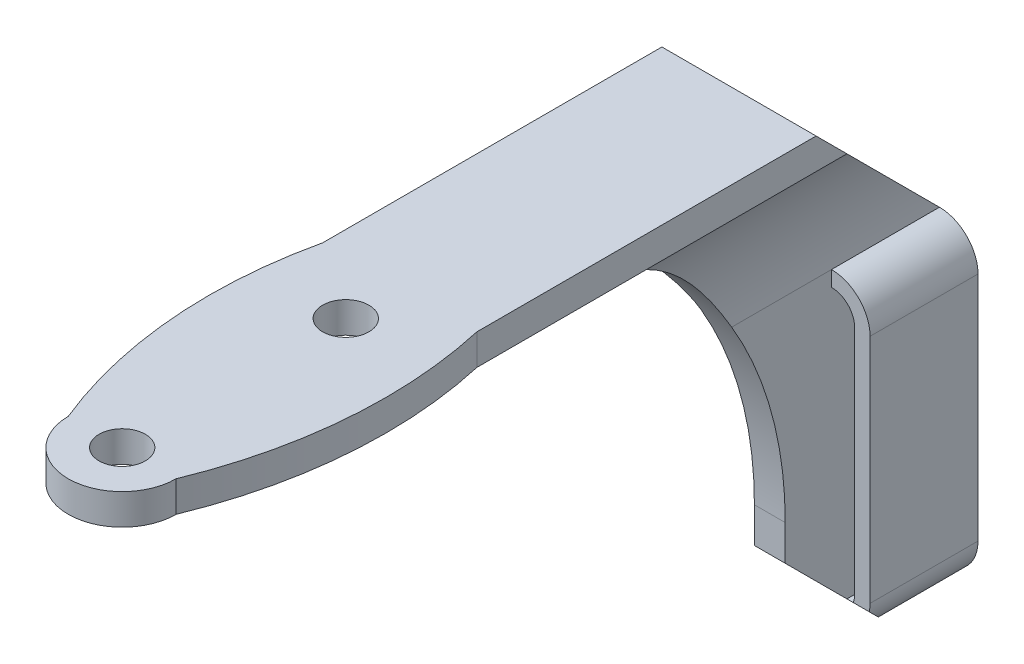
ISO-10303-21;
HEADER;
FILE_DESCRIPTION(('STEP AP214'),'2;1');
FILE_NAME('part.step','',(''),(''),'','','');
FILE_SCHEMA(('AUTOMOTIVE_DESIGN { 1 0 10303 214 1 1 1 1 }'));
ENDSEC;
DATA;
#1=APPLICATION_CONTEXT('core data for automotive mechanical design processes');
#2=APPLICATION_PROTOCOL_DEFINITION('international standard','automotive_design',2000,#1);
#3=PRODUCT_CONTEXT('',#1,'mechanical');
#4=PRODUCT('Part','Part','',(#3));
#5=PRODUCT_RELATED_PRODUCT_CATEGORY('part','',(#4));
#6=PRODUCT_DEFINITION_FORMATION('','',#4);
#7=PRODUCT_DEFINITION_CONTEXT('part definition',#1,'design');
#8=PRODUCT_DEFINITION('design','',#6,#7);
#9=PRODUCT_DEFINITION_SHAPE('','',#8);
#10=(LENGTH_UNIT() NAMED_UNIT(*) SI_UNIT(.MILLI.,.METRE.));
#11=(NAMED_UNIT(*) PLANE_ANGLE_UNIT() SI_UNIT($,.RADIAN.));
#12=(NAMED_UNIT(*) SI_UNIT($,.STERADIAN.) SOLID_ANGLE_UNIT());
#13=UNCERTAINTY_MEASURE_WITH_UNIT(LENGTH_MEASURE(1.E-05),#10,'distance_accuracy_value','');
#14=(GEOMETRIC_REPRESENTATION_CONTEXT(3) GLOBAL_UNCERTAINTY_ASSIGNED_CONTEXT((#13)) GLOBAL_UNIT_ASSIGNED_CONTEXT((#10,
#11,#12)) REPRESENTATION_CONTEXT('',''));
#15=CARTESIAN_POINT('',(0.,0.,0.));
#16=DIRECTION('',(0.,0.,1.));
#17=DIRECTION('',(1.,0.,0.));
#18=AXIS2_PLACEMENT_3D('',#15,#16,#17);
#19=CARTESIAN_POINT('',(3.,-8.00000000000004,3.501));
#20=DIRECTION('',(-1.,0.,0.));
#21=DIRECTION('',(0.,-1.,0.));
#22=AXIS2_PLACEMENT_3D('',#19,#20,#21);
#23=PLANE('',#22);
#24=DIRECTION('',(0.,1.,0.));
#25=VECTOR('',#24,1.);
#26=CARTESIAN_POINT('',(3.,-8.00000000000004,-40.));
#27=LINE('',#26,#25);
#28=CARTESIAN_POINT('',(3.,-23.,-40.));
#29=VERTEX_POINT('',#28);
#30=CARTESIAN_POINT('',(3.,-20.712315177208,-40.));
#31=VERTEX_POINT('',#30);
#32=EDGE_CURVE('E210',#29,#31,#27,.T.);
#33=ORIENTED_EDGE('',*,*,#32,.F.);
#34=DIRECTION('',(0.,0.707106781186549,0.707106781186546));
#35=VECTOR('',#34,1.);
#36=CARTESIAN_POINT('',(3.,-28.,-45.));
#37=LINE('',#36,#35);
#38=CARTESIAN_POINT('',(3.,-27.,-44.));
#39=VERTEX_POINT('',#38);
#40=EDGE_CURVE('E247',#29,#39,#37,.F.);
#41=ORIENTED_EDGE('',*,*,#40,.T.);
#42=DIRECTION('',(0.,0.,-1.));
#43=VECTOR('',#42,1.);
#44=CARTESIAN_POINT('',(3.,-27.,-43.));
#45=LINE('',#44,#43);
#46=CARTESIAN_POINT('',(3.,-27.,-50.));
#47=VERTEX_POINT('',#46);
#48=EDGE_CURVE('E199',#39,#47,#45,.T.);
#49=ORIENTED_EDGE('',*,*,#48,.T.);
#50=DIRECTION('',(0.,1.,0.));
#51=VECTOR('',#50,1.);
#52=CARTESIAN_POINT('',(3.,-8.00000000000004,-50.));
#53=LINE('',#52,#51);
#54=CARTESIAN_POINT('',(3.,-9.00000000000004,-50.));
#55=VERTEX_POINT('',#54);
#56=EDGE_CURVE('E225',#47,#55,#53,.T.);
#57=ORIENTED_EDGE('',*,*,#56,.T.);
#58=DIRECTION('',(0.,0.,-1.));
#59=VECTOR('',#58,1.);
#60=CARTESIAN_POINT('',(3.,-9.00000000000004,-43.));
#61=LINE('',#60,#59);
#62=CARTESIAN_POINT('',(3.,-9.00000000000004,-43.));
#63=VERTEX_POINT('',#62);
#64=EDGE_CURVE('E201',#63,#55,#61,.T.);
#65=ORIENTED_EDGE('',*,*,#64,.F.);
#66=DIRECTION('',(0.,-1.,0.));
#67=VECTOR('',#66,1.);
#68=CARTESIAN_POINT('',(3.,0.,-43.));
#69=LINE('',#68,#67);
#70=CARTESIAN_POINT('',(3.,-8.00000000000004,-43.));
#71=VERTEX_POINT('',#70);
#72=EDGE_CURVE('E434',#71,#63,#69,.T.);
#73=ORIENTED_EDGE('',*,*,#72,.F.);
#74=DIRECTION('',(0.,0.,-1.));
#75=VECTOR('',#74,1.);
#76=CARTESIAN_POINT('',(3.,-8.00000000000004,3.501));
#77=LINE('',#76,#75);
#78=CARTESIAN_POINT('',(3.,-8.00000000000005,-36.5266588869552));
#79=VERTEX_POINT('',#78);
#80=EDGE_CURVE('E331',#79,#71,#77,.T.);
#81=ORIENTED_EDGE('',*,*,#80,.F.);
#82=CARTESIAN_POINT('',(3.,-20.712315177208,-15.));
#83=DIRECTION('',(-1.,0.,0.));
#84=DIRECTION('',(0.,-1.,0.));
#85=AXIS2_PLACEMENT_3D('',#82,#83,#84);
#86=CIRCLE('',#85,25.);
#87=EDGE_CURVE('E213',#31,#79,#86,.F.);
#88=ORIENTED_EDGE('',*,*,#87,.F.);
#89=EDGE_LOOP('',(#33,#41,#49,#57,#65,#73,#81,#88));
#90=FACE_BOUND('',#89,.T.);
#91=ADVANCED_FACE('F39',(#90),#23,.F.);
#92=CARTESIAN_POINT('',(-5.,2.,0.));
#93=DIRECTION('',(-1.,0.,0.));
#94=DIRECTION('',(0.,0.,1.));
#95=AXIS2_PLACEMENT_3D('',#92,#93,#94);
#96=PLANE('',#95);
#97=DIRECTION('',(0.,0.,-1.));
#98=VECTOR('',#97,1.);
#99=CARTESIAN_POINT('',(-5.,0.,3.501));
#100=LINE('',#99,#98);
#101=CARTESIAN_POINT('',(-5.,0.,-29.));
#102=VERTEX_POINT('',#101);
#103=CARTESIAN_POINT('',(-5.,0.,-42.));
#104=VERTEX_POINT('',#103);
#105=EDGE_CURVE('E337',#102,#104,#100,.T.);
#106=ORIENTED_EDGE('',*,*,#105,.F.);
#107=DIRECTION('',(0.,0.,-1.));
#108=VECTOR('',#107,1.);
#109=CARTESIAN_POINT('',(-5.,0.,0.));
#110=LINE('',#109,#108);
#111=CARTESIAN_POINT('',(-5.,0.,-18.));
#112=VERTEX_POINT('',#111);
#113=EDGE_CURVE('E292',#112,#102,#110,.T.);
#114=ORIENTED_EDGE('',*,*,#113,.F.);
#115=DIRECTION('',(0.,-1.,0.));
#116=VECTOR('',#115,1.);
#117=CARTESIAN_POINT('',(-5.,2.,-18.));
#118=LINE('',#117,#116);
#119=CARTESIAN_POINT('',(-5.,2.,-18.));
#120=VERTEX_POINT('',#119);
#121=EDGE_CURVE('E264',#120,#112,#118,.T.);
#122=ORIENTED_EDGE('',*,*,#121,.F.);
#123=DIRECTION('',(0.,0.,-1.));
#124=VECTOR('',#123,1.);
#125=CARTESIAN_POINT('',(-5.,2.,0.));
#126=LINE('',#125,#124);
#127=CARTESIAN_POINT('',(-5.,2.,-40.));
#128=VERTEX_POINT('',#127);
#129=EDGE_CURVE('E278',#120,#128,#126,.T.);
#130=ORIENTED_EDGE('',*,*,#129,.T.);
#131=DIRECTION('',(0.,-0.707106781186549,-0.707106781186546));
#132=VECTOR('',#131,1.);
#133=CARTESIAN_POINT('',(-5.,2.,-40.));
#134=LINE('',#133,#132);
#135=EDGE_CURVE('E322',#128,#104,#134,.T.);
#136=ORIENTED_EDGE('',*,*,#135,.T.);
#137=EDGE_LOOP('',(#106,#114,#122,#130,#136));
#138=FACE_BOUND('',#137,.T.);
#139=ADVANCED_FACE('F235',(#138),#96,.T.);
#140=CARTESIAN_POINT('',(24.2595265384797,2.,-11.3757938782066));
#141=DIRECTION('',(0.,-1.,0.));
#142=DIRECTION('',(0.,0.,-1.));
#143=AXIS2_PLACEMENT_3D('',#140,#141,#142);
#144=CYLINDRICAL_SURFACE('',#143,30.);
#145=CARTESIAN_POINT('',(24.2595265384797,0.,-11.3757938782066));
#146=DIRECTION('',(0.,1.,0.));
#147=DIRECTION('',(0.,0.,1.));
#148=AXIS2_PLACEMENT_3D('',#145,#146,#147);
#149=CIRCLE('',#148,30.);
#150=CARTESIAN_POINT('',(-3.5,0.,0.));
#151=VERTEX_POINT('',#150);
#152=EDGE_CURVE('E289',#151,#112,#149,.F.);
#153=ORIENTED_EDGE('',*,*,#152,.F.);
#154=DIRECTION('',(0.,-1.,0.));
#155=VECTOR('',#154,1.);
#156=CARTESIAN_POINT('',(-3.5,2.,0.));
#157=LINE('',#156,#155);
#158=CARTESIAN_POINT('',(-3.5,2.,0.));
#159=VERTEX_POINT('',#158);
#160=EDGE_CURVE('E266',#159,#151,#157,.T.);
#161=ORIENTED_EDGE('',*,*,#160,.F.);
#162=CARTESIAN_POINT('',(24.2595265384797,2.,-11.3757938782066));
#163=DIRECTION('',(0.,1.,0.));
#164=DIRECTION('',(0.,0.,1.));
#165=AXIS2_PLACEMENT_3D('',#162,#163,#164);
#166=CIRCLE('',#165,30.);
#167=EDGE_CURVE('E311',#159,#120,#166,.F.);
#168=ORIENTED_EDGE('',*,*,#167,.T.);
#169=ORIENTED_EDGE('',*,*,#121,.T.);
#170=EDGE_LOOP('',(#153,#161,#168,#169));
#171=FACE_BOUND('',#170,.T.);
#172=ADVANCED_FACE('F242',(#171),#144,.T.);
#173=CARTESIAN_POINT('',(0.,2.,0.));
#174=DIRECTION('',(0.,-1.,0.));
#175=DIRECTION('',(0.,0.,-1.));
#176=AXIS2_PLACEMENT_3D('',#173,#174,#175);
#177=CYLINDRICAL_SURFACE('',#176,3.5);
#178=CARTESIAN_POINT('',(0.,0.,0.));
#179=DIRECTION('',(0.,1.,0.));
#180=DIRECTION('',(0.,0.,1.));
#181=AXIS2_PLACEMENT_3D('',#178,#179,#180);
#182=CIRCLE('',#181,3.5);
#183=CARTESIAN_POINT('',(3.5,0.,0.));
#184=VERTEX_POINT('',#183);
#185=EDGE_CURVE('E287',#151,#184,#182,.T.);
#186=ORIENTED_EDGE('',*,*,#185,.T.);
#187=DIRECTION('',(0.,-1.,0.));
#188=VECTOR('',#187,1.);
#189=CARTESIAN_POINT('',(3.5,2.,0.));
#190=LINE('',#189,#188);
#191=CARTESIAN_POINT('',(3.5,2.,0.));
#192=VERTEX_POINT('',#191);
#193=EDGE_CURVE('E268',#192,#184,#190,.T.);
#194=ORIENTED_EDGE('',*,*,#193,.F.);
#195=CARTESIAN_POINT('',(0.,2.,0.));
#196=DIRECTION('',(0.,1.,0.));
#197=DIRECTION('',(0.,0.,1.));
#198=AXIS2_PLACEMENT_3D('',#195,#196,#197);
#199=CIRCLE('',#198,3.5);
#200=EDGE_CURVE('E309',#159,#192,#199,.T.);
#201=ORIENTED_EDGE('',*,*,#200,.F.);
#202=ORIENTED_EDGE('',*,*,#160,.T.);
#203=EDGE_LOOP('',(#186,#194,#201,#202));
#204=FACE_BOUND('',#203,.T.);
#205=ADVANCED_FACE('F471',(#204),#177,.T.);
#206=CARTESIAN_POINT('',(-24.2595265384797,2.,-11.3757938782066));
#207=DIRECTION('',(0.,-1.,0.));
#208=DIRECTION('',(0.,0.,-1.));
#209=AXIS2_PLACEMENT_3D('',#206,#207,#208);
#210=CYLINDRICAL_SURFACE('',#209,30.);
#211=CARTESIAN_POINT('',(-24.2595265384797,0.,-11.3757938782066));
#212=DIRECTION('',(0.,1.,0.));
#213=DIRECTION('',(0.,0.,1.));
#214=AXIS2_PLACEMENT_3D('',#211,#212,#213);
#215=CIRCLE('',#214,30.);
#216=CARTESIAN_POINT('',(5.,0.,-18.));
#217=VERTEX_POINT('',#216);
#218=EDGE_CURVE('E285',#184,#217,#215,.T.);
#219=ORIENTED_EDGE('',*,*,#218,.T.);
#220=DIRECTION('',(0.,-1.,0.));
#221=VECTOR('',#220,1.);
#222=CARTESIAN_POINT('',(5.,2.,-18.));
#223=LINE('',#222,#221);
#224=CARTESIAN_POINT('',(5.,2.,-18.));
#225=VERTEX_POINT('',#224);
#226=EDGE_CURVE('E271',#225,#217,#223,.T.);
#227=ORIENTED_EDGE('',*,*,#226,.F.);
#228=CARTESIAN_POINT('',(-24.2595265384797,2.,-11.3757938782066));
#229=DIRECTION('',(0.,1.,0.));
#230=DIRECTION('',(0.,0.,1.));
#231=AXIS2_PLACEMENT_3D('',#228,#229,#230);
#232=CIRCLE('',#231,30.);
#233=EDGE_CURVE('E307',#192,#225,#232,.T.);
#234=ORIENTED_EDGE('',*,*,#233,.F.);
#235=ORIENTED_EDGE('',*,*,#193,.T.);
#236=EDGE_LOOP('',(#219,#227,#234,#235));
#237=FACE_BOUND('',#236,.T.);
#238=ADVANCED_FACE('F456',(#237),#210,.T.);
#239=CARTESIAN_POINT('',(5.,2.,0.));
#240=DIRECTION('',(-1.,0.,0.));
#241=DIRECTION('',(0.,0.,1.));
#242=AXIS2_PLACEMENT_3D('',#239,#240,#241);
#243=PLANE('',#242);
#244=DIRECTION('',(0.,0.,-1.));
#245=VECTOR('',#244,1.);
#246=CARTESIAN_POINT('',(5.,0.,0.));
#247=LINE('',#246,#245);
#248=CARTESIAN_POINT('',(5.,0.,-29.));
#249=VERTEX_POINT('',#248);
#250=EDGE_CURVE('E282',#217,#249,#247,.T.);
#251=ORIENTED_EDGE('',*,*,#250,.T.);
#252=DIRECTION('',(0.,0.,-1.));
#253=VECTOR('',#252,1.);
#254=CARTESIAN_POINT('',(5.,0.,3.501));
#255=LINE('',#254,#253);
#256=CARTESIAN_POINT('',(5.,0.,-42.));
#257=VERTEX_POINT('',#256);
#258=EDGE_CURVE('E423',#249,#257,#255,.T.);
#259=ORIENTED_EDGE('',*,*,#258,.T.);
#260=DIRECTION('',(0.,0.707106781186549,0.707106781186546));
#261=VECTOR('',#260,1.);
#262=CARTESIAN_POINT('',(5.,2.,-40.));
#263=LINE('',#262,#261);
#264=CARTESIAN_POINT('',(5.,2.,-40.));
#265=VERTEX_POINT('',#264);
#266=EDGE_CURVE('E295',#257,#265,#263,.T.);
#267=ORIENTED_EDGE('',*,*,#266,.T.);
#268=DIRECTION('',(0.,0.,-1.));
#269=VECTOR('',#268,1.);
#270=CARTESIAN_POINT('',(5.,2.,0.));
#271=LINE('',#270,#269);
#272=EDGE_CURVE('E304',#225,#265,#271,.T.);
#273=ORIENTED_EDGE('',*,*,#272,.F.);
#274=ORIENTED_EDGE('',*,*,#226,.T.);
#275=EDGE_LOOP('',(#251,#259,#267,#273,#274));
#276=FACE_BOUND('',#275,.T.);
#277=ADVANCED_FACE('F451',(#276),#243,.F.);
#278=CARTESIAN_POINT('',(0.,2.,-14.5));
#279=DIRECTION('',(0.,-1.,0.));
#280=DIRECTION('',(0.,0.,-1.));
#281=AXIS2_PLACEMENT_3D('',#278,#279,#280);
#282=CYLINDRICAL_SURFACE('',#281,1.5);
#283=CARTESIAN_POINT('',(0.,2.,-14.5));
#284=DIRECTION('',(0.,1.,0.));
#285=DIRECTION('',(0.,0.,1.));
#286=AXIS2_PLACEMENT_3D('',#283,#284,#285);
#287=CIRCLE('',#286,1.5);
#288=CARTESIAN_POINT('',(0.,2.,-13.));
#289=VERTEX_POINT('',#288);
#290=EDGE_CURVE('E298',#289,#289,#287,.T.);
#291=ORIENTED_EDGE('',*,*,#290,.T.);
#292=EDGE_LOOP('',(#291));
#293=FACE_BOUND('',#292,.T.);
#294=CARTESIAN_POINT('',(0.,0.,-14.5));
#295=DIRECTION('',(0.,1.,0.));
#296=DIRECTION('',(0.,0.,1.));
#297=AXIS2_PLACEMENT_3D('',#294,#295,#296);
#298=CIRCLE('',#297,1.5);
#299=CARTESIAN_POINT('',(0.,0.,-13.));
#300=VERTEX_POINT('',#299);
#301=EDGE_CURVE('E279',#300,#300,#298,.T.);
#302=ORIENTED_EDGE('',*,*,#301,.F.);
#303=EDGE_LOOP('',(#302));
#304=FACE_BOUND('',#303,.T.);
#305=ADVANCED_FACE('F483',(#293,#304),#282,.F.);
#306=CARTESIAN_POINT('',(0.,2.,0.));
#307=DIRECTION('',(0.,-1.,0.));
#308=DIRECTION('',(0.,0.,-1.));
#309=AXIS2_PLACEMENT_3D('',#306,#307,#308);
#310=CYLINDRICAL_SURFACE('',#309,1.5);
#311=CARTESIAN_POINT('',(0.,2.,0.));
#312=DIRECTION('',(0.,1.,0.));
#313=DIRECTION('',(0.,0.,1.));
#314=AXIS2_PLACEMENT_3D('',#311,#312,#313);
#315=CIRCLE('',#314,1.5);
#316=CARTESIAN_POINT('',(0.,2.,1.5));
#317=VERTEX_POINT('',#316);
#318=EDGE_CURVE('E274',#317,#317,#315,.T.);
#319=ORIENTED_EDGE('',*,*,#318,.T.);
#320=EDGE_LOOP('',(#319));
#321=FACE_BOUND('',#320,.T.);
#322=CARTESIAN_POINT('',(0.,0.,0.));
#323=DIRECTION('',(0.,1.,0.));
#324=DIRECTION('',(0.,0.,1.));
#325=AXIS2_PLACEMENT_3D('',#322,#323,#324);
#326=CIRCLE('',#325,1.5);
#327=CARTESIAN_POINT('',(0.,0.,1.5));
#328=VERTEX_POINT('',#327);
#329=EDGE_CURVE('E275',#328,#328,#326,.T.);
#330=ORIENTED_EDGE('',*,*,#329,.F.);
#331=EDGE_LOOP('',(#330));
#332=FACE_BOUND('',#331,.T.);
#333=ADVANCED_FACE('F486',(#321,#332),#310,.F.);
#334=CARTESIAN_POINT('',(0.,2.,0.));
#335=DIRECTION('',(0.,1.,0.));
#336=DIRECTION('',(0.,0.,1.));
#337=AXIS2_PLACEMENT_3D('',#334,#335,#336);
#338=PLANE('',#337);
#339=ORIENTED_EDGE('',*,*,#129,.F.);
#340=ORIENTED_EDGE('',*,*,#167,.F.);
#341=ORIENTED_EDGE('',*,*,#200,.T.);
#342=ORIENTED_EDGE('',*,*,#233,.T.);
#343=ORIENTED_EDGE('',*,*,#272,.T.);
#344=DIRECTION('',(1.,0.,0.));
#345=VECTOR('',#344,1.);
#346=CARTESIAN_POINT('',(0.,2.,-40.));
#347=LINE('',#346,#345);
#348=EDGE_CURVE('E301',#128,#265,#347,.T.);
#349=ORIENTED_EDGE('',*,*,#348,.F.);
#350=EDGE_LOOP('',(#339,#340,#341,#342,#343,#349));
#351=FACE_BOUND('',#350,.T.);
#352=ORIENTED_EDGE('',*,*,#290,.F.);
#353=EDGE_LOOP('',(#352));
#354=FACE_BOUND('',#353,.T.);
#355=ORIENTED_EDGE('',*,*,#318,.F.);
#356=EDGE_LOOP('',(#355));
#357=FACE_BOUND('',#356,.T.);
#358=ADVANCED_FACE('F469',(#351,#354,#357),#338,.T.);
#359=CARTESIAN_POINT('',(0.,0.,0.));
#360=DIRECTION('',(0.,1.,0.));
#361=DIRECTION('',(0.,0.,1.));
#362=AXIS2_PLACEMENT_3D('',#359,#360,#361);
#363=PLANE('',#362);
#364=ORIENTED_EDGE('',*,*,#113,.T.);
#365=DIRECTION('',(-1.,0.,0.));
#366=VECTOR('',#365,1.);
#367=CARTESIAN_POINT('',(41.6196668472012,0.,-29.));
#368=LINE('',#367,#366);
#369=EDGE_CURVE('E317',#249,#102,#368,.T.);
#370=ORIENTED_EDGE('',*,*,#369,.F.);
#371=ORIENTED_EDGE('',*,*,#250,.F.);
#372=ORIENTED_EDGE('',*,*,#218,.F.);
#373=ORIENTED_EDGE('',*,*,#185,.F.);
#374=ORIENTED_EDGE('',*,*,#152,.T.);
#375=EDGE_LOOP('',(#364,#370,#371,#372,#373,#374));
#376=FACE_BOUND('',#375,.T.);
#377=ORIENTED_EDGE('',*,*,#301,.T.);
#378=EDGE_LOOP('',(#377));
#379=FACE_BOUND('',#378,.T.);
#380=ORIENTED_EDGE('',*,*,#329,.T.);
#381=EDGE_LOOP('',(#380));
#382=FACE_BOUND('',#381,.T.);
#383=ADVANCED_FACE('F447',(#376,#379,#382),#363,.F.);
#384=CARTESIAN_POINT('',(41.6196668472012,-20.712315177208,-15.));
#385=DIRECTION('',(-1.,0.,0.));
#386=DIRECTION('',(0.,0.,1.));
#387=AXIS2_PLACEMENT_3D('',#384,#385,#386);
#388=CYLINDRICAL_SURFACE('',#387,25.);
#389=CARTESIAN_POINT('',(3.,-8.00000000000004,-36.5266588869552));
#390=CARTESIAN_POINT('',(2.99999580462506,-7.75038819519168,-36.3792651174216));
#391=CARTESIAN_POINT('',(3.00549716053365,-7.50337685452871,-36.2275289558978));
#392=CARTESIAN_POINT('',(3.02679442307417,-7.01514247905956,-35.9158120341279));
#393=CARTESIAN_POINT('',(3.04258791730226,-6.77391810156457,-35.7558332139925));
#394=CARTESIAN_POINT('',(3.08372364477095,-6.29807375344321,-35.4282400450313));
#395=CARTESIAN_POINT('',(3.10905196068306,-6.06344468994087,-35.2606371365393));
#396=CARTESIAN_POINT('',(3.16852821704776,-5.60084298882064,-34.9179890698206));
#397=CARTESIAN_POINT('',(3.20267662525565,-5.37287070494518,-34.7429435173002));
#398=CARTESIAN_POINT('',(3.31576272515417,-4.70827091671569,-34.2142312446301));
#399=CARTESIAN_POINT('',(3.40621821189699,-4.28153003476962,-33.8504764445567));
#400=CARTESIAN_POINT('',(3.61281033827825,-3.45677992397404,-33.0985670921227));
#401=CARTESIAN_POINT('',(3.72895171516378,-3.05877601306656,-32.7104080483527));
#402=CARTESIAN_POINT('',(3.9366700394531,-2.42891789059433,-32.0541616194088));
#403=CARTESIAN_POINT('',(4.02228526082989,-2.18833034487854,-31.7924884902044));
#404=CARTESIAN_POINT('',(4.20060777162859,-1.71971064144598,-31.2605828074033));
#405=CARTESIAN_POINT('',(4.29331315671006,-1.4916751404879,-30.9903525635004));
#406=CARTESIAN_POINT('',(4.48573855285015,-1.04532379387523,-30.4381718116508));
#407=CARTESIAN_POINT('',(4.58553408058722,-0.827172820501143,-30.1561146155544));
#408=CARTESIAN_POINT('',(4.78968901456291,-0.403838062211779,-29.5839753935456));
#409=CARTESIAN_POINT('',(4.89404893183818,-0.198655735608425,-29.2938924704023));
#410=CARTESIAN_POINT('',(5.,0.,-29.));
#411=B_SPLINE_CURVE_WITH_KNOTS('',3,(#389,#390,#391,#392,#393,#394,#395,#396,#397,#398,#399,
#400,#401,#402,#403,#404,#405,#406,#407,#408,#409,#410),.UNSPECIFIED.,.F.,.F.,(4,2,2,2,2,2,2,2,
2,2,4),(0.,0.869500085178186,1.73879643900593,2.60682882935166,3.47490726345164,
5.17670609986137,6.87881906104727,7.97534981898743,9.07158708812649,10.1820739539312,
11.2926854715708),.UNSPECIFIED.);
#412=EDGE_CURVE('E216',#79,#249,#411,.T.);
#413=ORIENTED_EDGE('',*,*,#412,.T.);
#414=ORIENTED_EDGE('',*,*,#369,.T.);
#415=CARTESIAN_POINT('',(-5.,0.,-29.));
#416=CARTESIAN_POINT('',(-4.88186766393004,-0.0344587097533036,-29.0509818725378));
#417=CARTESIAN_POINT('',(-4.76572240243279,-0.0711697003634557,-29.1048862027124));
#418=CARTESIAN_POINT('',(-4.537447077308,-0.148758192726174,-29.2177636574372));
#419=CARTESIAN_POINT('',(-4.42531447042487,-0.189632989874247,-29.2767334878336));
#420=CARTESIAN_POINT('',(-4.09552268189401,-0.317776482752463,-29.4597671709309));
#421=CARTESIAN_POINT('',(-3.88366617414296,-0.410803141260251,-29.5903123366206));
#422=CARTESIAN_POINT('',(-3.47667581720298,-0.609363727777018,-29.8626897486462));
#423=CARTESIAN_POINT('',(-3.28141830590359,-0.714788012124037,-30.0044198697108));
#424=CARTESIAN_POINT('',(-2.90455147965644,-0.937544644651366,-30.2968067714885));
#425=CARTESIAN_POINT('',(-2.72295729197832,-1.05488986292473,-30.4474731253516));
#426=CARTESIAN_POINT('',(-2.30712659843473,-1.34656143303145,-30.8126754747277));
#427=CARTESIAN_POINT('',(-2.07870813909412,-1.5257457787328,-31.0299620534154));
#428=CARTESIAN_POINT('',(-1.645228353769,-1.90307948953424,-31.4710963276821));
#429=CARTESIAN_POINT('',(-1.44016753563046,-2.10122926681177,-31.6949441657843));
#430=CARTESIAN_POINT('',(-1.05158482580992,-2.51680068572534,-32.1469554611938));
#431=CARTESIAN_POINT('',(-0.868201370115501,-2.7343321045082,-32.3751368759126));
#432=CARTESIAN_POINT('',(-0.524575096133196,-3.18689729909275,-32.831517621905));
#433=CARTESIAN_POINT('',(-0.364330638597485,-3.42192983326427,-33.0597169507623));
#434=CARTESIAN_POINT('',(-0.0651613692089105,-3.9131604633387,-33.5176434330052));
#435=CARTESIAN_POINT('',(0.0733401220698509,-4.16965753079822,-33.7473271606248));
#436=CARTESIAN_POINT('',(0.324118762496395,-4.69943094610734,-34.2018058078947));
#437=CARTESIAN_POINT('',(0.436390254551673,-4.97271089754549,-34.4265996634703));
#438=CARTESIAN_POINT('',(0.632107352642805,-5.53343931962016,-34.8677712993707));
#439=CARTESIAN_POINT('',(0.71570071849174,-5.82080616994597,-35.0841869626593));
#440=CARTESIAN_POINT('',(0.852339338200035,-6.40930317256183,-35.5074370895711));
#441=CARTESIAN_POINT('',(0.905410579234058,-6.71042138013749,-35.7142795656007));
#442=CARTESIAN_POINT('',(0.960954788697374,-7.1781264344881,-36.0205320144885));
#443=CARTESIAN_POINT('',(0.975487850658526,-7.34055077061766,-36.1242300335926));
#444=CARTESIAN_POINT('',(0.995011916380433,-7.66825254306464,-36.3281442440898));
#445=CARTESIAN_POINT('',(0.999997809621969,-7.83353145968154,-36.4283585425136));
#446=CARTESIAN_POINT('',(1.,-8.00000000000004,-36.5266588869552));
#447=B_SPLINE_CURVE_WITH_KNOTS('',3,(#415,#416,#417,#418,#419,#420,#421,#422,#423,#424,#425,
#426,#427,#428,#429,#430,#431,#432,#433,#434,#435,#436,#437,#438,#439,#440,#441,#442,#443,#444,
#445,#446),.UNSPECIFIED.,.F.,.F.,(4,2,2,2,2,2,2,2,2,2,2,2,2,2,2,4),(0.,0.399431230059353,
0.798604643831275,1.59423327628077,2.38329077365875,3.17320939492557,4.25955757191192,
5.34592936396532,6.43890172865515,7.5317966253194,8.64386392162051,9.75617083943051,
10.8626575207033,11.9682007160642,12.5476995951751,13.1275085885466),.UNSPECIFIED.);
#448=CARTESIAN_POINT('',(1.,-8.00000000000005,-36.5266588869552));
#449=VERTEX_POINT('',#448);
#450=EDGE_CURVE('E347',#102,#449,#447,.T.);
#451=ORIENTED_EDGE('',*,*,#450,.T.);
#452=CARTESIAN_POINT('',(1.,-20.712315177208,-15.));
#453=DIRECTION('',(1.,0.,0.));
#454=DIRECTION('',(0.,1.,0.));
#455=AXIS2_PLACEMENT_3D('',#452,#453,#454);
#456=CIRCLE('',#455,25.);
#457=CARTESIAN_POINT('',(1.,-20.712315177208,-40.));
#458=VERTEX_POINT('',#457);
#459=EDGE_CURVE('E211',#449,#458,#456,.F.);
#460=ORIENTED_EDGE('',*,*,#459,.T.);
#461=DIRECTION('',(-1.,0.,0.));
#462=VECTOR('',#461,1.);
#463=CARTESIAN_POINT('',(41.6196668472012,-20.712315177208,-40.));
#464=LINE('',#463,#462);
#465=EDGE_CURVE('E325',#31,#458,#464,.T.);
#466=ORIENTED_EDGE('',*,*,#465,.F.);
#467=ORIENTED_EDGE('',*,*,#87,.T.);
#468=EDGE_LOOP('',(#413,#414,#451,#460,#466,#467));
#469=FACE_BOUND('',#468,.T.);
#470=ADVANCED_FACE('F444',(#469),#388,.F.);
#471=CARTESIAN_POINT('',(41.6196668472012,-28.,-40.));
#472=DIRECTION('',(0.,0.,1.));
#473=DIRECTION('',(1.,0.,0.));
#474=AXIS2_PLACEMENT_3D('',#471,#472,#473);
#475=PLANE('',#474);
#476=DIRECTION('',(0.,-1.,0.));
#477=VECTOR('',#476,1.);
#478=CARTESIAN_POINT('',(1.,-8.00000000000004,-40.));
#479=LINE('',#478,#477);
#480=CARTESIAN_POINT('',(0.999999999999998,-23.,-40.));
#481=VERTEX_POINT('',#480);
#482=EDGE_CURVE('E334',#458,#481,#479,.T.);
#483=ORIENTED_EDGE('',*,*,#482,.T.);
#484=DIRECTION('',(1.,0.,0.));
#485=VECTOR('',#484,1.);
#486=CARTESIAN_POINT('',(41.6196668472012,-23.,-40.));
#487=LINE('',#486,#485);
#488=EDGE_CURVE('E254',#481,#29,#487,.T.);
#489=ORIENTED_EDGE('',*,*,#488,.T.);
#490=ORIENTED_EDGE('',*,*,#32,.T.);
#491=ORIENTED_EDGE('',*,*,#465,.T.);
#492=EDGE_LOOP('',(#483,#489,#490,#491));
#493=FACE_BOUND('',#492,.T.);
#494=ADVANCED_FACE('F500',(#493),#475,.T.);
#495=CARTESIAN_POINT('',(41.6196668472012,-28.,-50.));
#496=DIRECTION('',(0.,-1.,0.));
#497=DIRECTION('',(0.,0.,-1.));
#498=AXIS2_PLACEMENT_3D('',#495,#496,#497);
#499=PLANE('',#498);
#500=DIRECTION('',(0.,0.,-1.));
#501=VECTOR('',#500,1.);
#502=CARTESIAN_POINT('',(3.,-28.,-43.));
#503=LINE('',#502,#501);
#504=CARTESIAN_POINT('',(3.,-28.,-45.));
#505=VERTEX_POINT('',#504);
#506=CARTESIAN_POINT('',(3.,-28.,-50.));
#507=VERTEX_POINT('',#506);
#508=EDGE_CURVE('E383',#505,#507,#503,.T.);
#509=ORIENTED_EDGE('',*,*,#508,.F.);
#510=DIRECTION('',(-1.,0.,0.));
#511=VECTOR('',#510,1.);
#512=CARTESIAN_POINT('',(41.6196668472012,-28.,-45.));
#513=LINE('',#512,#511);
#514=CARTESIAN_POINT('',(0.999999999999997,-28.,-45.));
#515=VERTEX_POINT('',#514);
#516=EDGE_CURVE('E261',#505,#515,#513,.T.);
#517=ORIENTED_EDGE('',*,*,#516,.T.);
#518=DIRECTION('',(0.,0.,-1.));
#519=VECTOR('',#518,1.);
#520=CARTESIAN_POINT('',(0.999999999999997,-28.,3.501));
#521=LINE('',#520,#519);
#522=CARTESIAN_POINT('',(0.999999999999997,-28.,-50.));
#523=VERTEX_POINT('',#522);
#524=EDGE_CURVE('E341',#515,#523,#521,.T.);
#525=ORIENTED_EDGE('',*,*,#524,.T.);
#526=DIRECTION('',(-1.,0.,0.));
#527=VECTOR('',#526,1.);
#528=CARTESIAN_POINT('',(41.6196668472012,-28.,-50.));
#529=LINE('',#528,#527);
#530=EDGE_CURVE('E321',#507,#523,#529,.T.);
#531=ORIENTED_EDGE('',*,*,#530,.F.);
#532=EDGE_LOOP('',(#509,#517,#525,#531));
#533=FACE_BOUND('',#532,.T.);
#534=ADVANCED_FACE('F380',(#533),#499,.T.);
#535=CARTESIAN_POINT('',(41.6196668472012,-8.00000000000004,-50.));
#536=DIRECTION('',(0.,0.,-1.));
#537=DIRECTION('',(-1.,0.,0.));
#538=AXIS2_PLACEMENT_3D('',#535,#536,#537);
#539=PLANE('',#538);
#540=CARTESIAN_POINT('',(3.,-10.5,-50.));
#541=DIRECTION('',(0.,0.,-1.));
#542=DIRECTION('',(-1.,0.,0.));
#543=AXIS2_PLACEMENT_3D('',#540,#541,#542);
#544=CIRCLE('',#543,1.5);
#545=CARTESIAN_POINT('',(4.5,-10.5,-50.));
#546=VERTEX_POINT('',#545);
#547=EDGE_CURVE('E400',#55,#546,#544,.T.);
#548=ORIENTED_EDGE('',*,*,#547,.F.);
#549=ORIENTED_EDGE('',*,*,#56,.F.);
#550=CARTESIAN_POINT('',(3.,-25.5,-50.));
#551=DIRECTION('',(0.,0.,-1.));
#552=DIRECTION('',(-1.,0.,0.));
#553=AXIS2_PLACEMENT_3D('',#550,#551,#552);
#554=CIRCLE('',#553,1.5);
#555=CARTESIAN_POINT('',(4.5,-25.5,-50.));
#556=VERTEX_POINT('',#555);
#557=EDGE_CURVE('E397',#47,#556,#554,.F.);
#558=ORIENTED_EDGE('',*,*,#557,.T.);
#559=DIRECTION('',(0.,-1.,0.));
#560=VECTOR('',#559,1.);
#561=CARTESIAN_POINT('',(4.5,0.,-50.));
#562=LINE('',#561,#560);
#563=EDGE_CURVE('E196',#546,#556,#562,.T.);
#564=ORIENTED_EDGE('',*,*,#563,.F.);
#565=EDGE_LOOP('',(#548,#549,#558,#564));
#566=FACE_BOUND('',#565,.T.);
#567=DIRECTION('',(-1.,0.,0.));
#568=VECTOR('',#567,1.);
#569=CARTESIAN_POINT('',(41.6196668472012,-8.00000000000004,-50.));
#570=LINE('',#569,#568);
#571=CARTESIAN_POINT('',(3.,-8.00000000000004,-50.));
#572=VERTEX_POINT('',#571);
#573=CARTESIAN_POINT('',(1.,-8.00000000000004,-50.));
#574=VERTEX_POINT('',#573);
#575=EDGE_CURVE('E318',#572,#574,#570,.T.);
#576=ORIENTED_EDGE('',*,*,#575,.F.);
#577=CARTESIAN_POINT('',(3.,-10.5,-50.));
#578=DIRECTION('',(0.,0.,-1.));
#579=DIRECTION('',(-1.,0.,0.));
#580=AXIS2_PLACEMENT_3D('',#577,#578,#579);
#581=CIRCLE('',#580,2.5);
#582=CARTESIAN_POINT('',(5.5,-10.5,-50.));
#583=VERTEX_POINT('',#582);
#584=EDGE_CURVE('E402',#572,#583,#581,.T.);
#585=ORIENTED_EDGE('',*,*,#584,.T.);
#586=DIRECTION('',(0.,-1.,0.));
#587=VECTOR('',#586,1.);
#588=CARTESIAN_POINT('',(5.5,0.,-50.));
#589=LINE('',#588,#587);
#590=CARTESIAN_POINT('',(5.5,-25.5,-50.));
#591=VERTEX_POINT('',#590);
#592=EDGE_CURVE('E405',#583,#591,#589,.T.);
#593=ORIENTED_EDGE('',*,*,#592,.T.);
#594=CARTESIAN_POINT('',(3.,-25.5,-50.));
#595=DIRECTION('',(0.,0.,-1.));
#596=DIRECTION('',(-1.,0.,0.));
#597=AXIS2_PLACEMENT_3D('',#594,#595,#596);
#598=CIRCLE('',#597,2.5);
#599=EDGE_CURVE('E183',#507,#591,#598,.F.);
#600=ORIENTED_EDGE('',*,*,#599,.F.);
#601=ORIENTED_EDGE('',*,*,#530,.T.);
#602=DIRECTION('',(0.,-1.,0.));
#603=VECTOR('',#602,1.);
#604=CARTESIAN_POINT('',(1.,-8.00000000000004,-50.));
#605=LINE('',#604,#603);
#606=EDGE_CURVE('E342',#574,#523,#605,.T.);
#607=ORIENTED_EDGE('',*,*,#606,.F.);
#608=EDGE_LOOP('',(#576,#585,#593,#600,#601,#607));
#609=FACE_BOUND('',#608,.T.);
#610=ADVANCED_FACE('F421',(#566,#609),#539,.T.);
#611=CARTESIAN_POINT('',(41.6196668472012,2.,-40.));
#612=DIRECTION('',(0.,0.707106781186546,-0.707106781186549));
#613=DIRECTION('',(0.,0.707106781186549,0.707106781186546));
#614=AXIS2_PLACEMENT_3D('',#611,#612,#613);
#615=PLANE('',#614);
#616=CARTESIAN_POINT('',(20.0000000000002,-8.00000000000004,-50.));
#617=DIRECTION('',(0.,0.707106781186546,-0.707106781186549));
#618=DIRECTION('',(0.,-0.707106781186549,-0.707106781186546));
#619=AXIS2_PLACEMENT_3D('',#616,#617,#618);
#620=ELLIPSE('',#619,24.0416305603428,17.0000000000002);
#621=EDGE_CURVE('E207',#257,#572,#620,.F.);
#622=ORIENTED_EDGE('',*,*,#621,.T.);
#623=ORIENTED_EDGE('',*,*,#575,.T.);
#624=CARTESIAN_POINT('',(-7.33333333333339,-8.00000000000004,-50.));
#625=DIRECTION('',(0.,0.707106781186546,-0.707106781186549));
#626=DIRECTION('',(0.,-0.707106781186549,-0.707106781186546));
#627=AXIS2_PLACEMENT_3D('',#624,#625,#626);
#628=ELLIPSE('',#627,11.7851130197758,8.33333333333339);
#629=EDGE_CURVE('E355',#574,#104,#628,.F.);
#630=ORIENTED_EDGE('',*,*,#629,.T.);
#631=ORIENTED_EDGE('',*,*,#135,.F.);
#632=ORIENTED_EDGE('',*,*,#348,.T.);
#633=ORIENTED_EDGE('',*,*,#266,.F.);
#634=EDGE_LOOP('',(#622,#623,#630,#631,#632,#633));
#635=FACE_BOUND('',#634,.T.);
#636=ADVANCED_FACE('F373',(#635),#615,.T.);
#637=CARTESIAN_POINT('',(-7.33333333333339,-8.00000000000004,3.501));
#638=DIRECTION('',(0.,0.,-1.));
#639=DIRECTION('',(-1.,0.,0.));
#640=AXIS2_PLACEMENT_3D('',#637,#638,#639);
#641=CYLINDRICAL_SURFACE('',#640,8.33333333333339);
#642=ORIENTED_EDGE('',*,*,#105,.T.);
#643=ORIENTED_EDGE('',*,*,#629,.F.);
#644=DIRECTION('',(0.,0.,-1.));
#645=VECTOR('',#644,1.);
#646=CARTESIAN_POINT('',(1.,-8.00000000000004,3.501));
#647=LINE('',#646,#645);
#648=EDGE_CURVE('E338',#449,#574,#647,.T.);
#649=ORIENTED_EDGE('',*,*,#648,.F.);
#650=ORIENTED_EDGE('',*,*,#450,.F.);
#651=EDGE_LOOP('',(#642,#643,#649,#650));
#652=FACE_BOUND('',#651,.T.);
#653=ADVANCED_FACE('F357',(#652),#641,.F.);
#654=CARTESIAN_POINT('',(1.,-8.00000000000004,3.501));
#655=DIRECTION('',(1.,0.,0.));
#656=DIRECTION('',(0.,1.,0.));
#657=AXIS2_PLACEMENT_3D('',#654,#655,#656);
#658=PLANE('',#657);
#659=ORIENTED_EDGE('',*,*,#524,.F.);
#660=DIRECTION('',(0.,-0.707106781186549,-0.707106781186546));
#661=VECTOR('',#660,1.);
#662=CARTESIAN_POINT('',(1.,-28.,-45.));
#663=LINE('',#662,#661);
#664=EDGE_CURVE('E257',#515,#481,#663,.F.);
#665=ORIENTED_EDGE('',*,*,#664,.T.);
#666=ORIENTED_EDGE('',*,*,#482,.F.);
#667=ORIENTED_EDGE('',*,*,#459,.F.);
#668=ORIENTED_EDGE('',*,*,#648,.T.);
#669=ORIENTED_EDGE('',*,*,#606,.T.);
#670=EDGE_LOOP('',(#659,#665,#666,#667,#668,#669));
#671=FACE_BOUND('',#670,.T.);
#672=ADVANCED_FACE('F362',(#671),#658,.F.);
#673=CARTESIAN_POINT('',(20.0000000000002,-8.00000000000004,3.501));
#674=DIRECTION('',(0.,0.,-1.));
#675=DIRECTION('',(-1.,0.,0.));
#676=AXIS2_PLACEMENT_3D('',#673,#674,#675);
#677=CYLINDRICAL_SURFACE('',#676,17.0000000000002);
#678=ORIENTED_EDGE('',*,*,#80,.T.);
#679=DIRECTION('',(0.,0.,-1.));
#680=VECTOR('',#679,1.);
#681=CARTESIAN_POINT('',(3.,-8.00000000000004,-43.));
#682=LINE('',#681,#680);
#683=EDGE_CURVE('E413',#71,#572,#682,.T.);
#684=ORIENTED_EDGE('',*,*,#683,.T.);
#685=ORIENTED_EDGE('',*,*,#621,.F.);
#686=ORIENTED_EDGE('',*,*,#258,.F.);
#687=ORIENTED_EDGE('',*,*,#412,.F.);
#688=EDGE_LOOP('',(#678,#684,#685,#686,#687));
#689=FACE_BOUND('',#688,.T.);
#690=ADVANCED_FACE('F227',(#689),#677,.F.);
#691=CARTESIAN_POINT('',(3.,-25.5,-43.));
#692=DIRECTION('',(0.,0.,-1.));
#693=DIRECTION('',(-1.,0.,0.));
#694=AXIS2_PLACEMENT_3D('',#691,#692,#693);
#695=CYLINDRICAL_SURFACE('',#694,2.5);
#696=CARTESIAN_POINT('',(3.,-25.5,-43.));
#697=DIRECTION('',(0.,0.,-1.));
#698=DIRECTION('',(-1.,0.,0.));
#699=AXIS2_PLACEMENT_3D('',#696,#697,#698);
#700=CIRCLE('',#699,2.5);
#701=CARTESIAN_POINT('',(5.44948974278317,-26.,-43.));
#702=VERTEX_POINT('',#701);
#703=CARTESIAN_POINT('',(5.5,-25.5,-43.));
#704=VERTEX_POINT('',#703);
#705=EDGE_CURVE('E203',#702,#704,#700,.F.);
#706=ORIENTED_EDGE('',*,*,#705,.F.);
#707=CARTESIAN_POINT('',(3.,-25.5,-42.5));
#708=DIRECTION('',(0.,0.707106781186546,-0.70710678118655));
#709=DIRECTION('',(0.,-0.70710678118655,-0.707106781186546));
#710=AXIS2_PLACEMENT_3D('',#707,#708,#709);
#711=ELLIPSE('',#710,3.53553390593273,2.5);
#712=EDGE_CURVE('E11',#702,#505,#711,.T.);
#713=ORIENTED_EDGE('',*,*,#712,.T.);
#714=ORIENTED_EDGE('',*,*,#508,.T.);
#715=ORIENTED_EDGE('',*,*,#599,.T.);
#716=DIRECTION('',(0.,0.,-1.));
#717=VECTOR('',#716,1.);
#718=CARTESIAN_POINT('',(5.5,-25.5,-43.));
#719=LINE('',#718,#717);
#720=EDGE_CURVE('E388',#704,#591,#719,.T.);
#721=ORIENTED_EDGE('',*,*,#720,.F.);
#722=EDGE_LOOP('',(#706,#713,#714,#715,#721));
#723=FACE_BOUND('',#722,.T.);
#724=ADVANCED_FACE('F370',(#723),#695,.T.);
#725=CARTESIAN_POINT('',(5.5,0.,-43.));
#726=DIRECTION('',(1.,0.,0.));
#727=DIRECTION('',(0.,1.,0.));
#728=AXIS2_PLACEMENT_3D('',#725,#726,#727);
#729=PLANE('',#728);
#730=ORIENTED_EDGE('',*,*,#592,.F.);
#731=DIRECTION('',(0.,0.,-1.));
#732=VECTOR('',#731,1.);
#733=CARTESIAN_POINT('',(5.5,-10.5,-43.));
#734=LINE('',#733,#732);
#735=CARTESIAN_POINT('',(5.5,-10.5,-43.));
#736=VERTEX_POINT('',#735);
#737=EDGE_CURVE('E411',#736,#583,#734,.T.);
#738=ORIENTED_EDGE('',*,*,#737,.F.);
#739=DIRECTION('',(0.,-1.,0.));
#740=VECTOR('',#739,1.);
#741=CARTESIAN_POINT('',(5.5,0.,-43.));
#742=LINE('',#741,#740);
#743=EDGE_CURVE('E391',#736,#704,#742,.T.);
#744=ORIENTED_EDGE('',*,*,#743,.T.);
#745=ORIENTED_EDGE('',*,*,#720,.T.);
#746=EDGE_LOOP('',(#730,#738,#744,#745));
#747=FACE_BOUND('',#746,.T.);
#748=ADVANCED_FACE('F439',(#747),#729,.T.);
#749=CARTESIAN_POINT('',(3.,-10.5,-43.));
#750=DIRECTION('',(0.,0.,-1.));
#751=DIRECTION('',(-1.,0.,0.));
#752=AXIS2_PLACEMENT_3D('',#749,#750,#751);
#753=CYLINDRICAL_SURFACE('',#752,2.5);
#754=ORIENTED_EDGE('',*,*,#584,.F.);
#755=ORIENTED_EDGE('',*,*,#683,.F.);
#756=CARTESIAN_POINT('',(3.,-10.5,-43.));
#757=DIRECTION('',(0.,0.,-1.));
#758=DIRECTION('',(-1.,0.,0.));
#759=AXIS2_PLACEMENT_3D('',#756,#757,#758);
#760=CIRCLE('',#759,2.5);
#761=EDGE_CURVE('E393',#71,#736,#760,.T.);
#762=ORIENTED_EDGE('',*,*,#761,.T.);
#763=ORIENTED_EDGE('',*,*,#737,.T.);
#764=EDGE_LOOP('',(#754,#755,#762,#763));
#765=FACE_BOUND('',#764,.T.);
#766=ADVANCED_FACE('F433',(#765),#753,.T.);
#767=CARTESIAN_POINT('',(3.,-10.5,-43.));
#768=DIRECTION('',(0.,0.,-1.));
#769=DIRECTION('',(-1.,0.,0.));
#770=AXIS2_PLACEMENT_3D('',#767,#768,#769);
#771=CYLINDRICAL_SURFACE('',#770,1.5);
#772=ORIENTED_EDGE('',*,*,#547,.T.);
#773=DIRECTION('',(0.,0.,-1.));
#774=VECTOR('',#773,1.);
#775=CARTESIAN_POINT('',(4.5,-10.5,-43.));
#776=LINE('',#775,#774);
#777=CARTESIAN_POINT('',(4.5,-10.5,-43.));
#778=VERTEX_POINT('',#777);
#779=EDGE_CURVE('E198',#778,#546,#776,.T.);
#780=ORIENTED_EDGE('',*,*,#779,.F.);
#781=CARTESIAN_POINT('',(3.,-10.5,-43.));
#782=DIRECTION('',(0.,0.,-1.));
#783=DIRECTION('',(-1.,0.,0.));
#784=AXIS2_PLACEMENT_3D('',#781,#782,#783);
#785=CIRCLE('',#784,1.5);
#786=EDGE_CURVE('E189',#63,#778,#785,.T.);
#787=ORIENTED_EDGE('',*,*,#786,.F.);
#788=ORIENTED_EDGE('',*,*,#64,.T.);
#789=EDGE_LOOP('',(#772,#780,#787,#788));
#790=FACE_BOUND('',#789,.T.);
#791=ADVANCED_FACE('F418',(#790),#771,.F.);
#792=CARTESIAN_POINT('',(4.5,0.,-43.));
#793=DIRECTION('',(1.,0.,0.));
#794=DIRECTION('',(0.,1.,0.));
#795=AXIS2_PLACEMENT_3D('',#792,#793,#794);
#796=PLANE('',#795);
#797=ORIENTED_EDGE('',*,*,#563,.T.);
#798=DIRECTION('',(0.,0.,-1.));
#799=VECTOR('',#798,1.);
#800=CARTESIAN_POINT('',(4.5,-25.5,-43.));
#801=LINE('',#800,#799);
#802=CARTESIAN_POINT('',(4.5,-25.5,-43.));
#803=VERTEX_POINT('',#802);
#804=EDGE_CURVE('E180',#803,#556,#801,.T.);
#805=ORIENTED_EDGE('',*,*,#804,.F.);
#806=DIRECTION('',(0.,-1.,0.));
#807=VECTOR('',#806,1.);
#808=CARTESIAN_POINT('',(4.5,0.,-43.));
#809=LINE('',#808,#807);
#810=EDGE_CURVE('E182',#778,#803,#809,.T.);
#811=ORIENTED_EDGE('',*,*,#810,.F.);
#812=ORIENTED_EDGE('',*,*,#779,.T.);
#813=EDGE_LOOP('',(#797,#805,#811,#812));
#814=FACE_BOUND('',#813,.T.);
#815=ADVANCED_FACE('F194',(#814),#796,.F.);
#816=CARTESIAN_POINT('',(3.,-25.5,-43.));
#817=DIRECTION('',(0.,0.,-1.));
#818=DIRECTION('',(-1.,0.,0.));
#819=AXIS2_PLACEMENT_3D('',#816,#817,#818);
#820=CYLINDRICAL_SURFACE('',#819,1.5);
#821=ORIENTED_EDGE('',*,*,#48,.F.);
#822=CARTESIAN_POINT('',(3.,-25.5,-42.5));
#823=DIRECTION('',(0.,0.707106781186546,-0.70710678118655));
#824=DIRECTION('',(0.,-0.70710678118655,-0.707106781186546));
#825=AXIS2_PLACEMENT_3D('',#822,#823,#824);
#826=ELLIPSE('',#825,2.12132034355963,1.5);
#827=CARTESIAN_POINT('',(4.41421356237309,-26.,-43.));
#828=VERTEX_POINT('',#827);
#829=EDGE_CURVE('E61',#39,#828,#826,.F.);
#830=ORIENTED_EDGE('',*,*,#829,.T.);
#831=CARTESIAN_POINT('',(3.,-25.5,-43.));
#832=DIRECTION('',(0.,0.,-1.));
#833=DIRECTION('',(-1.,0.,0.));
#834=AXIS2_PLACEMENT_3D('',#831,#832,#833);
#835=CIRCLE('',#834,1.5);
#836=EDGE_CURVE('E175',#828,#803,#835,.F.);
#837=ORIENTED_EDGE('',*,*,#836,.T.);
#838=ORIENTED_EDGE('',*,*,#804,.T.);
#839=ORIENTED_EDGE('',*,*,#557,.F.);
#840=EDGE_LOOP('',(#821,#830,#837,#838,#839));
#841=FACE_BOUND('',#840,.T.);
#842=ADVANCED_FACE('F177',(#841),#820,.F.);
#843=CARTESIAN_POINT('',(0.,0.,-43.));
#844=DIRECTION('',(0.,0.,-1.));
#845=DIRECTION('',(-1.,0.,0.));
#846=AXIS2_PLACEMENT_3D('',#843,#844,#845);
#847=PLANE('',#846);
#848=ORIENTED_EDGE('',*,*,#836,.F.);
#849=DIRECTION('',(-1.,0.,0.));
#850=VECTOR('',#849,1.);
#851=CARTESIAN_POINT('',(41.6196668472012,-26.,-43.));
#852=LINE('',#851,#850);
#853=EDGE_CURVE('E47',#828,#702,#852,.F.);
#854=ORIENTED_EDGE('',*,*,#853,.T.);
#855=ORIENTED_EDGE('',*,*,#705,.T.);
#856=ORIENTED_EDGE('',*,*,#743,.F.);
#857=ORIENTED_EDGE('',*,*,#761,.F.);
#858=ORIENTED_EDGE('',*,*,#72,.T.);
#859=ORIENTED_EDGE('',*,*,#786,.T.);
#860=ORIENTED_EDGE('',*,*,#810,.T.);
#861=EDGE_LOOP('',(#848,#854,#855,#856,#857,#858,#859,#860));
#862=FACE_BOUND('',#861,.T.);
#863=ADVANCED_FACE('F186',(#862),#847,.F.);
#864=CARTESIAN_POINT('',(41.6196668472012,-28.,-45.));
#865=DIRECTION('',(0.,0.707106781186546,-0.70710678118655));
#866=DIRECTION('',(-1.,0.,0.));
#867=AXIS2_PLACEMENT_3D('',#864,#865,#866);
#868=PLANE('',#867);
#869=ORIENTED_EDGE('',*,*,#40,.F.);
#870=ORIENTED_EDGE('',*,*,#488,.F.);
#871=ORIENTED_EDGE('',*,*,#664,.F.);
#872=ORIENTED_EDGE('',*,*,#516,.F.);
#873=ORIENTED_EDGE('',*,*,#712,.F.);
#874=ORIENTED_EDGE('',*,*,#853,.F.);
#875=ORIENTED_EDGE('',*,*,#829,.F.);
#876=EDGE_LOOP('',(#869,#870,#871,#872,#873,#874,#875));
#877=FACE_BOUND('',#876,.T.);
#878=ADVANCED_FACE('F41',(#877),#868,.F.);
#879=CLOSED_SHELL('',(#91,#139,#172,#205,#238,#277,#305,#333,#358,#383,#470,#494,#534,#610,#636,
#653,#672,#690,#724,#748,#766,#791,#815,#842,#863,#878));
#880=MANIFOLD_SOLID_BREP('B2',#879);
#881=ADVANCED_BREP_SHAPE_REPRESENTATION('',(#18,#880),#14);
#882=SHAPE_DEFINITION_REPRESENTATION(#9,#881);
ENDSEC;
END-ISO-10303-21;
